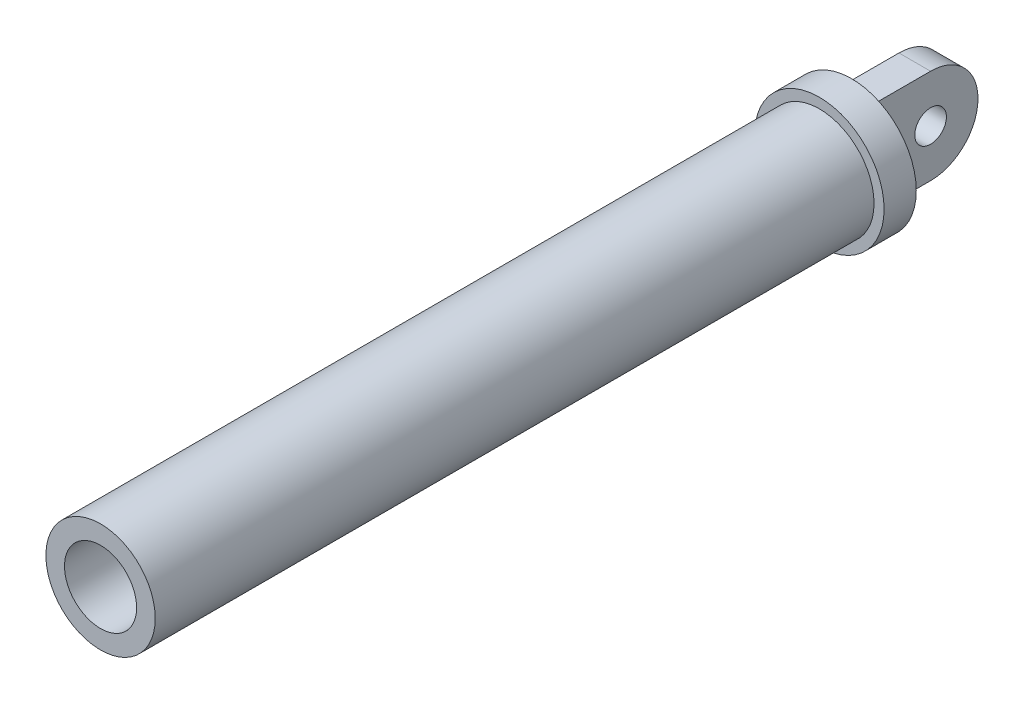
ISO-10303-21;
HEADER;
FILE_DESCRIPTION(('STEP AP214'),'2;1');
FILE_NAME('part.step','',(''),(''),'','','');
FILE_SCHEMA(('AUTOMOTIVE_DESIGN { 1 0 10303 214 1 1 1 1 }'));
ENDSEC;
DATA;
#1=APPLICATION_CONTEXT('core data for automotive mechanical design processes');
#2=APPLICATION_PROTOCOL_DEFINITION('international standard','automotive_design',2000,#1);
#3=PRODUCT_CONTEXT('',#1,'mechanical');
#4=PRODUCT('Part','Part','',(#3));
#5=PRODUCT_RELATED_PRODUCT_CATEGORY('part','',(#4));
#6=PRODUCT_DEFINITION_FORMATION('','',#4);
#7=PRODUCT_DEFINITION_CONTEXT('part definition',#1,'design');
#8=PRODUCT_DEFINITION('design','',#6,#7);
#9=PRODUCT_DEFINITION_SHAPE('','',#8);
#10=(LENGTH_UNIT() NAMED_UNIT(*) SI_UNIT(.MILLI.,.METRE.));
#11=(NAMED_UNIT(*) PLANE_ANGLE_UNIT() SI_UNIT($,.RADIAN.));
#12=(NAMED_UNIT(*) SI_UNIT($,.STERADIAN.) SOLID_ANGLE_UNIT());
#13=UNCERTAINTY_MEASURE_WITH_UNIT(LENGTH_MEASURE(1.E-05),#10,'distance_accuracy_value','');
#14=(GEOMETRIC_REPRESENTATION_CONTEXT(3) GLOBAL_UNCERTAINTY_ASSIGNED_CONTEXT((#13)) GLOBAL_UNIT_ASSIGNED_CONTEXT((#10,
#11,#12)) REPRESENTATION_CONTEXT('',''));
#15=CARTESIAN_POINT('',(0.,0.,0.));
#16=DIRECTION('',(0.,0.,1.));
#17=DIRECTION('',(1.,0.,0.));
#18=AXIS2_PLACEMENT_3D('',#15,#16,#17);
#19=CARTESIAN_POINT('',(5.,-15.,0.));
#20=DIRECTION('',(0.,-1.,0.));
#21=DIRECTION('',(0.,0.,-1.));
#22=AXIS2_PLACEMENT_3D('',#19,#20,#21);
#23=PLANE('',#22);
#24=DIRECTION('',(0.,0.,1.));
#25=VECTOR('',#24,1.);
#26=CARTESIAN_POINT('',(-5.,-15.,0.));
#27=LINE('',#26,#25);
#28=CARTESIAN_POINT('',(-5.,-15.,0.));
#29=VERTEX_POINT('',#28);
#30=CARTESIAN_POINT('',(-5.,-15.,20.));
#31=VERTEX_POINT('',#30);
#32=EDGE_CURVE('E102',#29,#31,#27,.T.);
#33=ORIENTED_EDGE('',*,*,#32,.F.);
#34=DIRECTION('',(-1.,0.,0.));
#35=VECTOR('',#34,1.);
#36=CARTESIAN_POINT('',(5.,-15.,0.));
#37=LINE('',#36,#35);
#38=CARTESIAN_POINT('',(5.,-15.,0.));
#39=VERTEX_POINT('',#38);
#40=EDGE_CURVE('E11',#39,#29,#37,.T.);
#41=ORIENTED_EDGE('',*,*,#40,.F.);
#42=DIRECTION('',(0.,0.,1.));
#43=VECTOR('',#42,1.);
#44=CARTESIAN_POINT('',(5.,-15.,0.));
#45=LINE('',#44,#43);
#46=CARTESIAN_POINT('',(5.,-15.,20.));
#47=VERTEX_POINT('',#46);
#48=EDGE_CURVE('E132',#39,#47,#45,.T.);
#49=ORIENTED_EDGE('',*,*,#48,.T.);
#50=DIRECTION('',(-1.,0.,0.));
#51=VECTOR('',#50,1.);
#52=CARTESIAN_POINT('',(5.,-15.,20.));
#53=LINE('',#52,#51);
#54=EDGE_CURVE('E82',#47,#31,#53,.T.);
#55=ORIENTED_EDGE('',*,*,#54,.T.);
#56=EDGE_LOOP('',(#33,#41,#49,#55));
#57=FACE_BOUND('',#56,.T.);
#58=ADVANCED_FACE('F43',(#57),#23,.T.);
#59=CARTESIAN_POINT('',(5.,0.,0.));
#60=DIRECTION('',(-1.,0.,0.));
#61=DIRECTION('',(0.,0.,1.));
#62=AXIS2_PLACEMENT_3D('',#59,#60,#61);
#63=CYLINDRICAL_SURFACE('',#62,15.);
#64=CARTESIAN_POINT('',(-5.,0.,0.));
#65=DIRECTION('',(1.,0.,0.));
#66=DIRECTION('',(0.,0.,-1.));
#67=AXIS2_PLACEMENT_3D('',#64,#65,#66);
#68=CIRCLE('',#67,15.);
#69=CARTESIAN_POINT('',(-5.,15.,0.));
#70=VERTEX_POINT('',#69);
#71=EDGE_CURVE('E98',#29,#70,#68,.T.);
#72=ORIENTED_EDGE('',*,*,#71,.T.);
#73=DIRECTION('',(-1.,0.,0.));
#74=VECTOR('',#73,1.);
#75=CARTESIAN_POINT('',(5.,15.,0.));
#76=LINE('',#75,#74);
#77=CARTESIAN_POINT('',(5.,15.,0.));
#78=VERTEX_POINT('',#77);
#79=EDGE_CURVE('E53',#78,#70,#76,.T.);
#80=ORIENTED_EDGE('',*,*,#79,.F.);
#81=CARTESIAN_POINT('',(5.,0.,0.));
#82=DIRECTION('',(1.,0.,0.));
#83=DIRECTION('',(0.,0.,-1.));
#84=AXIS2_PLACEMENT_3D('',#81,#82,#83);
#85=CIRCLE('',#84,15.);
#86=EDGE_CURVE('E128',#39,#78,#85,.T.);
#87=ORIENTED_EDGE('',*,*,#86,.F.);
#88=ORIENTED_EDGE('',*,*,#40,.T.);
#89=EDGE_LOOP('',(#72,#80,#87,#88));
#90=FACE_BOUND('',#89,.T.);
#91=ADVANCED_FACE('F204',(#90),#63,.T.);
#92=CARTESIAN_POINT('',(5.,15.,0.));
#93=DIRECTION('',(0.,-1.,0.));
#94=DIRECTION('',(0.,0.,-1.));
#95=AXIS2_PLACEMENT_3D('',#92,#93,#94);
#96=PLANE('',#95);
#97=DIRECTION('',(0.,0.,1.));
#98=VECTOR('',#97,1.);
#99=CARTESIAN_POINT('',(-5.,15.,0.));
#100=LINE('',#99,#98);
#101=CARTESIAN_POINT('',(-5.,15.,20.));
#102=VERTEX_POINT('',#101);
#103=EDGE_CURVE('E75',#70,#102,#100,.T.);
#104=ORIENTED_EDGE('',*,*,#103,.T.);
#105=DIRECTION('',(-1.,0.,0.));
#106=VECTOR('',#105,1.);
#107=CARTESIAN_POINT('',(5.,15.,20.));
#108=LINE('',#107,#106);
#109=CARTESIAN_POINT('',(5.,15.,20.));
#110=VERTEX_POINT('',#109);
#111=EDGE_CURVE('E93',#110,#102,#108,.T.);
#112=ORIENTED_EDGE('',*,*,#111,.F.);
#113=DIRECTION('',(0.,0.,1.));
#114=VECTOR('',#113,1.);
#115=CARTESIAN_POINT('',(5.,15.,0.));
#116=LINE('',#115,#114);
#117=EDGE_CURVE('E125',#78,#110,#116,.T.);
#118=ORIENTED_EDGE('',*,*,#117,.F.);
#119=ORIENTED_EDGE('',*,*,#79,.T.);
#120=EDGE_LOOP('',(#104,#112,#118,#119));
#121=FACE_BOUND('',#120,.T.);
#122=ADVANCED_FACE('F91',(#121),#96,.F.);
#123=CARTESIAN_POINT('',(5.,0.,0.));
#124=DIRECTION('',(-1.,0.,0.));
#125=DIRECTION('',(0.,0.,1.));
#126=AXIS2_PLACEMENT_3D('',#123,#124,#125);
#127=CYLINDRICAL_SURFACE('',#126,5.);
#128=CARTESIAN_POINT('',(5.,0.,0.));
#129=DIRECTION('',(1.,0.,0.));
#130=DIRECTION('',(0.,0.,-1.));
#131=AXIS2_PLACEMENT_3D('',#128,#129,#130);
#132=CIRCLE('',#131,5.);
#133=CARTESIAN_POINT('',(5.,0.,-5.));
#134=VERTEX_POINT('',#133);
#135=EDGE_CURVE('E105',#134,#134,#132,.T.);
#136=ORIENTED_EDGE('',*,*,#135,.T.);
#137=EDGE_LOOP('',(#136));
#138=FACE_BOUND('',#137,.T.);
#139=CARTESIAN_POINT('',(-5.,0.,0.));
#140=DIRECTION('',(1.,0.,0.));
#141=DIRECTION('',(0.,0.,-1.));
#142=AXIS2_PLACEMENT_3D('',#139,#140,#141);
#143=CIRCLE('',#142,5.);
#144=CARTESIAN_POINT('',(-5.,0.,-5.));
#145=VERTEX_POINT('',#144);
#146=EDGE_CURVE('E118',#145,#145,#143,.T.);
#147=ORIENTED_EDGE('',*,*,#146,.F.);
#148=EDGE_LOOP('',(#147));
#149=FACE_BOUND('',#148,.T.);
#150=ADVANCED_FACE('F45',(#138,#149),#127,.F.);
#151=CARTESIAN_POINT('',(5.,0.,0.));
#152=DIRECTION('',(1.,0.,0.));
#153=DIRECTION('',(0.,0.,-1.));
#154=AXIS2_PLACEMENT_3D('',#151,#152,#153);
#155=PLANE('',#154);
#156=ORIENTED_EDGE('',*,*,#135,.F.);
#157=EDGE_LOOP('',(#156));
#158=FACE_BOUND('',#157,.T.);
#159=ORIENTED_EDGE('',*,*,#48,.F.);
#160=ORIENTED_EDGE('',*,*,#86,.T.);
#161=ORIENTED_EDGE('',*,*,#117,.T.);
#162=DIRECTION('',(0.,-1.,0.));
#163=VECTOR('',#162,1.);
#164=CARTESIAN_POINT('',(5.,0.,20.));
#165=LINE('',#164,#163);
#166=EDGE_CURVE('E61',#110,#47,#165,.T.);
#167=ORIENTED_EDGE('',*,*,#166,.T.);
#168=EDGE_LOOP('',(#159,#160,#161,#167));
#169=FACE_BOUND('',#168,.T.);
#170=ADVANCED_FACE('F199',(#158,#169),#155,.T.);
#171=CARTESIAN_POINT('',(-5.,0.,0.));
#172=DIRECTION('',(1.,0.,0.));
#173=DIRECTION('',(0.,0.,-1.));
#174=AXIS2_PLACEMENT_3D('',#171,#172,#173);
#175=PLANE('',#174);
#176=ORIENTED_EDGE('',*,*,#146,.T.);
#177=EDGE_LOOP('',(#176));
#178=FACE_BOUND('',#177,.T.);
#179=ORIENTED_EDGE('',*,*,#32,.T.);
#180=DIRECTION('',(0.,-1.,0.));
#181=VECTOR('',#180,1.);
#182=CARTESIAN_POINT('',(-5.,0.,20.));
#183=LINE('',#182,#181);
#184=EDGE_CURVE('E97',#102,#31,#183,.T.);
#185=ORIENTED_EDGE('',*,*,#184,.F.);
#186=ORIENTED_EDGE('',*,*,#103,.F.);
#187=ORIENTED_EDGE('',*,*,#71,.F.);
#188=EDGE_LOOP('',(#179,#185,#186,#187));
#189=FACE_BOUND('',#188,.T.);
#190=ADVANCED_FACE('F101',(#178,#189),#175,.F.);
#191=CARTESIAN_POINT('',(0.,0.,20.));
#192=DIRECTION('',(0.,0.,1.));
#193=DIRECTION('',(1.,0.,0.));
#194=AXIS2_PLACEMENT_3D('',#191,#192,#193);
#195=PLANE('',#194);
#196=CARTESIAN_POINT('',(0.,0.,20.));
#197=DIRECTION('',(0.,0.,1.));
#198=DIRECTION('',(1.,0.,0.));
#199=AXIS2_PLACEMENT_3D('',#196,#197,#198);
#200=CIRCLE('',#199,20.4745876477853);
#201=CARTESIAN_POINT('',(20.4745876477853,0.,20.));
#202=VERTEX_POINT('',#201);
#203=EDGE_CURVE('E122',#202,#202,#200,.T.);
#204=ORIENTED_EDGE('',*,*,#203,.F.);
#205=EDGE_LOOP('',(#204));
#206=FACE_BOUND('',#205,.T.);
#207=ORIENTED_EDGE('',*,*,#111,.T.);
#208=ORIENTED_EDGE('',*,*,#184,.T.);
#209=ORIENTED_EDGE('',*,*,#54,.F.);
#210=ORIENTED_EDGE('',*,*,#166,.F.);
#211=EDGE_LOOP('',(#207,#208,#209,#210));
#212=FACE_BOUND('',#211,.T.);
#213=ADVANCED_FACE('F107',(#206,#212),#195,.F.);
#214=CARTESIAN_POINT('',(0.,0.,34.3382939073472));
#215=DIRECTION('',(0.,0.,1.));
#216=DIRECTION('',(1.,0.,0.));
#217=AXIS2_PLACEMENT_3D('',#214,#215,#216);
#218=CYLINDRICAL_SURFACE('',#217,20.4745876477853);
#219=CARTESIAN_POINT('',(0.,0.,30.174617149384));
#220=DIRECTION('',(0.,0.,1.));
#221=DIRECTION('',(1.,0.,0.));
#222=AXIS2_PLACEMENT_3D('',#219,#220,#221);
#223=CIRCLE('',#222,20.4745876477853);
#224=CARTESIAN_POINT('',(20.4745876477853,0.,30.174617149384));
#225=VERTEX_POINT('',#224);
#226=EDGE_CURVE('E141',#225,#225,#223,.T.);
#227=ORIENTED_EDGE('',*,*,#226,.F.);
#228=EDGE_LOOP('',(#227));
#229=FACE_BOUND('',#228,.T.);
#230=ORIENTED_EDGE('',*,*,#203,.T.);
#231=EDGE_LOOP('',(#230));
#232=FACE_BOUND('',#231,.T.);
#233=ADVANCED_FACE('F185',(#229,#232),#218,.T.);
#234=CARTESIAN_POINT('',(0.,20.4745876477853,30.174617149384));
#235=DIRECTION('',(0.,0.,-1.));
#236=DIRECTION('',(-1.,0.,0.));
#237=AXIS2_PLACEMENT_3D('',#234,#235,#236);
#238=PLANE('',#237);
#239=CARTESIAN_POINT('',(0.,0.,30.174617149384));
#240=DIRECTION('',(0.,0.,1.));
#241=DIRECTION('',(1.,0.,0.));
#242=AXIS2_PLACEMENT_3D('',#239,#240,#241);
#243=CIRCLE('',#242,17.289208906177);
#244=CARTESIAN_POINT('',(17.289208906177,0.,30.174617149384));
#245=VERTEX_POINT('',#244);
#246=EDGE_CURVE('E145',#245,#245,#243,.T.);
#247=ORIENTED_EDGE('',*,*,#246,.F.);
#248=EDGE_LOOP('',(#247));
#249=FACE_BOUND('',#248,.T.);
#250=ORIENTED_EDGE('',*,*,#226,.T.);
#251=EDGE_LOOP('',(#250));
#252=FACE_BOUND('',#251,.T.);
#253=ADVANCED_FACE('F179',(#249,#252),#238,.F.);
#254=CARTESIAN_POINT('',(0.,0.,34.3382939073472));
#255=DIRECTION('',(0.,0.,1.));
#256=DIRECTION('',(1.,0.,0.));
#257=AXIS2_PLACEMENT_3D('',#254,#255,#256);
#258=CYLINDRICAL_SURFACE('',#257,17.289208906177);
#259=CARTESIAN_POINT('',(0.,0.,257.531045688754));
#260=DIRECTION('',(0.,0.,1.));
#261=DIRECTION('',(1.,0.,0.));
#262=AXIS2_PLACEMENT_3D('',#259,#260,#261);
#263=CIRCLE('',#262,17.289208906177);
#264=CARTESIAN_POINT('',(17.289208906177,0.,257.531045688754));
#265=VERTEX_POINT('',#264);
#266=EDGE_CURVE('E149',#265,#265,#263,.T.);
#267=ORIENTED_EDGE('',*,*,#266,.F.);
#268=EDGE_LOOP('',(#267));
#269=FACE_BOUND('',#268,.T.);
#270=ORIENTED_EDGE('',*,*,#246,.T.);
#271=EDGE_LOOP('',(#270));
#272=FACE_BOUND('',#271,.T.);
#273=ADVANCED_FACE('F173',(#269,#272),#258,.T.);
#274=CARTESIAN_POINT('',(0.,17.289208906177,257.531045688754));
#275=DIRECTION('',(0.,0.,-1.));
#276=DIRECTION('',(-1.,0.,0.));
#277=AXIS2_PLACEMENT_3D('',#274,#275,#276);
#278=PLANE('',#277);
#279=CARTESIAN_POINT('',(0.,0.,257.531045688754));
#280=DIRECTION('',(0.,0.,1.));
#281=DIRECTION('',(1.,0.,0.));
#282=AXIS2_PLACEMENT_3D('',#279,#280,#281);
#283=CIRCLE('',#282,11.4085096909001);
#284=CARTESIAN_POINT('',(11.4085096909001,0.,257.531045688754));
#285=VERTEX_POINT('',#284);
#286=EDGE_CURVE('E153',#285,#285,#283,.T.);
#287=ORIENTED_EDGE('',*,*,#286,.F.);
#288=EDGE_LOOP('',(#287));
#289=FACE_BOUND('',#288,.T.);
#290=ORIENTED_EDGE('',*,*,#266,.T.);
#291=EDGE_LOOP('',(#290));
#292=FACE_BOUND('',#291,.T.);
#293=ADVANCED_FACE('F167',(#289,#292),#278,.F.);
#294=CARTESIAN_POINT('',(0.,0.,34.3382939073472));
#295=DIRECTION('',(0.,0.,1.));
#296=DIRECTION('',(1.,0.,0.));
#297=AXIS2_PLACEMENT_3D('',#294,#295,#296);
#298=CYLINDRICAL_SURFACE('',#297,11.4085096909001);
#299=CARTESIAN_POINT('',(0.,0.,34.3382939073472));
#300=DIRECTION('',(0.,0.,1.));
#301=DIRECTION('',(1.,0.,0.));
#302=AXIS2_PLACEMENT_3D('',#299,#300,#301);
#303=CIRCLE('',#302,11.4085096909001);
#304=CARTESIAN_POINT('',(11.4085096909001,0.,34.3382939073472));
#305=VERTEX_POINT('',#304);
#306=EDGE_CURVE('E157',#305,#305,#303,.T.);
#307=ORIENTED_EDGE('',*,*,#306,.F.);
#308=EDGE_LOOP('',(#307));
#309=FACE_BOUND('',#308,.T.);
#310=ORIENTED_EDGE('',*,*,#286,.T.);
#311=EDGE_LOOP('',(#310));
#312=FACE_BOUND('',#311,.T.);
#313=ADVANCED_FACE('F164',(#309,#312),#298,.F.);
#314=CARTESIAN_POINT('',(0.,11.4085096909001,34.3382939073472));
#315=DIRECTION('',(0.,0.,-1.));
#316=DIRECTION('',(-1.,0.,0.));
#317=AXIS2_PLACEMENT_3D('',#314,#315,#316);
#318=PLANE('',#317);
#319=ORIENTED_EDGE('',*,*,#306,.T.);
#320=EDGE_LOOP('',(#319));
#321=FACE_BOUND('',#320,.T.);
#322=ADVANCED_FACE('F162',(#321),#318,.F.);
#323=CLOSED_SHELL('',(#58,#91,#122,#150,#170,#190,#213,#233,#253,#273,#293,#313,#322));
#324=MANIFOLD_SOLID_BREP('B2',#323);
#325=ADVANCED_BREP_SHAPE_REPRESENTATION('',(#18,#324),#14);
#326=SHAPE_DEFINITION_REPRESENTATION(#9,#325);
ENDSEC;
END-ISO-10303-21;
